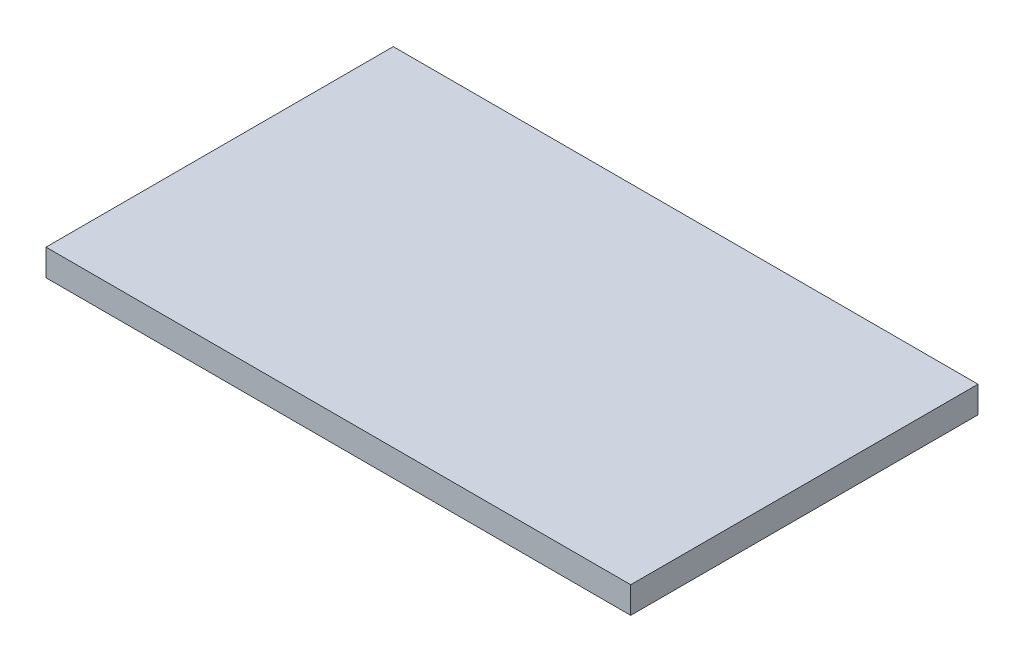
ISO-10303-21;
HEADER;
FILE_DESCRIPTION(('STEP AP214'),'2;1');
FILE_NAME('part.step','',(''),(''),'','','');
FILE_SCHEMA(('AUTOMOTIVE_DESIGN { 1 0 10303 214 1 1 1 1 }'));
ENDSEC;
DATA;
#1=APPLICATION_CONTEXT('core data for automotive mechanical design processes');
#2=APPLICATION_PROTOCOL_DEFINITION('international standard','automotive_design',2000,#1);
#3=PRODUCT_CONTEXT('',#1,'mechanical');
#4=PRODUCT('Part','Part','',(#3));
#5=PRODUCT_RELATED_PRODUCT_CATEGORY('part','',(#4));
#6=PRODUCT_DEFINITION_FORMATION('','',#4);
#7=PRODUCT_DEFINITION_CONTEXT('part definition',#1,'design');
#8=PRODUCT_DEFINITION('design','',#6,#7);
#9=PRODUCT_DEFINITION_SHAPE('','',#8);
#10=(LENGTH_UNIT() NAMED_UNIT(*) SI_UNIT(.MILLI.,.METRE.));
#11=(NAMED_UNIT(*) PLANE_ANGLE_UNIT() SI_UNIT($,.RADIAN.));
#12=(NAMED_UNIT(*) SI_UNIT($,.STERADIAN.) SOLID_ANGLE_UNIT());
#13=UNCERTAINTY_MEASURE_WITH_UNIT(LENGTH_MEASURE(1.E-05),#10,'distance_accuracy_value','');
#14=(GEOMETRIC_REPRESENTATION_CONTEXT(3) GLOBAL_UNCERTAINTY_ASSIGNED_CONTEXT((#13)) GLOBAL_UNIT_ASSIGNED_CONTEXT((#10,
#11,#12)) REPRESENTATION_CONTEXT('',''));
#15=CARTESIAN_POINT('',(0.,0.,0.));
#16=DIRECTION('',(0.,0.,1.));
#17=DIRECTION('',(1.,0.,0.));
#18=AXIS2_PLACEMENT_3D('',#15,#16,#17);
#19=CARTESIAN_POINT('',(61.5,1611.,-758.5));
#20=DIRECTION('',(-1.,0.,0.));
#21=DIRECTION('',(0.,0.,1.));
#22=AXIS2_PLACEMENT_3D('',#19,#20,#21);
#23=PLANE('',#22);
#24=DIRECTION('',(0.,-1.,0.));
#25=VECTOR('',#24,1.);
#26=CARTESIAN_POINT('',(61.5,1611.,0.));
#27=LINE('',#26,#25);
#28=CARTESIAN_POINT('',(61.5,1669.,0.));
#29=VERTEX_POINT('',#28);
#30=CARTESIAN_POINT('',(61.5,1611.,0.));
#31=VERTEX_POINT('',#30);
#32=EDGE_CURVE('E103',#29,#31,#27,.T.);
#33=ORIENTED_EDGE('',*,*,#32,.F.);
#34=DIRECTION('',(0.,0.,1.));
#35=VECTOR('',#34,1.);
#36=CARTESIAN_POINT('',(61.5,1669.,-758.5));
#37=LINE('',#36,#35);
#38=CARTESIAN_POINT('',(61.5,1669.,-758.5));
#39=VERTEX_POINT('',#38);
#40=EDGE_CURVE('E11',#39,#29,#37,.T.);
#41=ORIENTED_EDGE('',*,*,#40,.F.);
#42=DIRECTION('',(0.,-1.,0.));
#43=VECTOR('',#42,1.);
#44=CARTESIAN_POINT('',(61.5,1611.,-758.5));
#45=LINE('',#44,#43);
#46=CARTESIAN_POINT('',(61.5,1611.,-758.5));
#47=VERTEX_POINT('',#46);
#48=EDGE_CURVE('E97',#39,#47,#45,.T.);
#49=ORIENTED_EDGE('',*,*,#48,.T.);
#50=DIRECTION('',(0.,0.,1.));
#51=VECTOR('',#50,1.);
#52=CARTESIAN_POINT('',(61.5,1611.,-758.5));
#53=LINE('',#52,#51);
#54=EDGE_CURVE('E42',#47,#31,#53,.T.);
#55=ORIENTED_EDGE('',*,*,#54,.T.);
#56=EDGE_LOOP('',(#33,#41,#49,#55));
#57=FACE_BOUND('',#56,.T.);
#58=ADVANCED_FACE('F39',(#57),#23,.T.);
#59=CARTESIAN_POINT('',(61.5,1669.,-758.5));
#60=DIRECTION('',(0.,1.,0.));
#61=DIRECTION('',(0.,0.,1.));
#62=AXIS2_PLACEMENT_3D('',#59,#60,#61);
#63=PLANE('',#62);
#64=DIRECTION('',(-1.,0.,0.));
#65=VECTOR('',#64,1.);
#66=CARTESIAN_POINT('',(61.5,1669.,0.));
#67=LINE('',#66,#65);
#68=CARTESIAN_POINT('',(1338.5,1669.,0.));
#69=VERTEX_POINT('',#68);
#70=EDGE_CURVE('E99',#69,#29,#67,.T.);
#71=ORIENTED_EDGE('',*,*,#70,.F.);
#72=DIRECTION('',(0.,0.,1.));
#73=VECTOR('',#72,1.);
#74=CARTESIAN_POINT('',(1338.5,1669.,-758.5));
#75=LINE('',#74,#73);
#76=CARTESIAN_POINT('',(1338.5,1669.,-758.5));
#77=VERTEX_POINT('',#76);
#78=EDGE_CURVE('E48',#77,#69,#75,.T.);
#79=ORIENTED_EDGE('',*,*,#78,.F.);
#80=DIRECTION('',(-1.,0.,0.));
#81=VECTOR('',#80,1.);
#82=CARTESIAN_POINT('',(61.5,1669.,-758.5));
#83=LINE('',#82,#81);
#84=EDGE_CURVE('E94',#77,#39,#83,.T.);
#85=ORIENTED_EDGE('',*,*,#84,.T.);
#86=ORIENTED_EDGE('',*,*,#40,.T.);
#87=EDGE_LOOP('',(#71,#79,#85,#86));
#88=FACE_BOUND('',#87,.T.);
#89=ADVANCED_FACE('F113',(#88),#63,.T.);
#90=CARTESIAN_POINT('',(1338.5,1611.,-758.5));
#91=DIRECTION('',(1.,0.,0.));
#92=DIRECTION('',(0.,0.,-1.));
#93=AXIS2_PLACEMENT_3D('',#90,#91,#92);
#94=PLANE('',#93);
#95=DIRECTION('',(0.,1.,0.));
#96=VECTOR('',#95,1.);
#97=CARTESIAN_POINT('',(1338.5,1611.,0.));
#98=LINE('',#97,#96);
#99=CARTESIAN_POINT('',(1338.5,1611.,0.));
#100=VERTEX_POINT('',#99);
#101=EDGE_CURVE('E89',#100,#69,#98,.T.);
#102=ORIENTED_EDGE('',*,*,#101,.F.);
#103=DIRECTION('',(0.,0.,1.));
#104=VECTOR('',#103,1.);
#105=CARTESIAN_POINT('',(1338.5,1611.,-758.5));
#106=LINE('',#105,#104);
#107=CARTESIAN_POINT('',(1338.5,1611.,-758.5));
#108=VERTEX_POINT('',#107);
#109=EDGE_CURVE('E84',#108,#100,#106,.T.);
#110=ORIENTED_EDGE('',*,*,#109,.F.);
#111=DIRECTION('',(0.,1.,0.));
#112=VECTOR('',#111,1.);
#113=CARTESIAN_POINT('',(1338.5,1611.,-758.5));
#114=LINE('',#113,#112);
#115=EDGE_CURVE('E87',#108,#77,#114,.T.);
#116=ORIENTED_EDGE('',*,*,#115,.T.);
#117=ORIENTED_EDGE('',*,*,#78,.T.);
#118=EDGE_LOOP('',(#102,#110,#116,#117));
#119=FACE_BOUND('',#118,.T.);
#120=ADVANCED_FACE('F86',(#119),#94,.T.);
#121=CARTESIAN_POINT('',(61.5,1611.,-758.5));
#122=DIRECTION('',(0.,-1.,0.));
#123=DIRECTION('',(0.,0.,-1.));
#124=AXIS2_PLACEMENT_3D('',#121,#122,#123);
#125=PLANE('',#124);
#126=DIRECTION('',(1.,0.,0.));
#127=VECTOR('',#126,1.);
#128=CARTESIAN_POINT('',(61.5,1611.,0.));
#129=LINE('',#128,#127);
#130=EDGE_CURVE('E106',#31,#100,#129,.T.);
#131=ORIENTED_EDGE('',*,*,#130,.F.);
#132=ORIENTED_EDGE('',*,*,#54,.F.);
#133=DIRECTION('',(1.,0.,0.));
#134=VECTOR('',#133,1.);
#135=CARTESIAN_POINT('',(61.5,1611.,-758.5));
#136=LINE('',#135,#134);
#137=EDGE_CURVE('E93',#47,#108,#136,.T.);
#138=ORIENTED_EDGE('',*,*,#137,.T.);
#139=ORIENTED_EDGE('',*,*,#109,.T.);
#140=EDGE_LOOP('',(#131,#132,#138,#139));
#141=FACE_BOUND('',#140,.T.);
#142=ADVANCED_FACE('F96',(#141),#125,.T.);
#143=CARTESIAN_POINT('',(0.,0.,-758.5));
#144=DIRECTION('',(0.,0.,-1.));
#145=DIRECTION('',(-1.,0.,0.));
#146=AXIS2_PLACEMENT_3D('',#143,#144,#145);
#147=PLANE('',#146);
#148=ORIENTED_EDGE('',*,*,#48,.F.);
#149=ORIENTED_EDGE('',*,*,#84,.F.);
#150=ORIENTED_EDGE('',*,*,#115,.F.);
#151=ORIENTED_EDGE('',*,*,#137,.F.);
#152=EDGE_LOOP('',(#148,#149,#150,#151));
#153=FACE_BOUND('',#152,.T.);
#154=ADVANCED_FACE('F92',(#153),#147,.T.);
#155=CARTESIAN_POINT('',(0.,0.,0.));
#156=DIRECTION('',(0.,0.,-1.));
#157=DIRECTION('',(-1.,0.,0.));
#158=AXIS2_PLACEMENT_3D('',#155,#156,#157);
#159=PLANE('',#158);
#160=ORIENTED_EDGE('',*,*,#32,.T.);
#161=ORIENTED_EDGE('',*,*,#130,.T.);
#162=ORIENTED_EDGE('',*,*,#101,.T.);
#163=ORIENTED_EDGE('',*,*,#70,.T.);
#164=EDGE_LOOP('',(#160,#161,#162,#163));
#165=FACE_BOUND('',#164,.T.);
#166=ADVANCED_FACE('F112',(#165),#159,.F.);
#167=CLOSED_SHELL('',(#58,#89,#120,#142,#154,#166));
#168=MANIFOLD_SOLID_BREP('B2',#167);
#169=ADVANCED_BREP_SHAPE_REPRESENTATION('',(#18,#168),#14);
#170=SHAPE_DEFINITION_REPRESENTATION(#9,#169);
ENDSEC;
END-ISO-10303-21;
